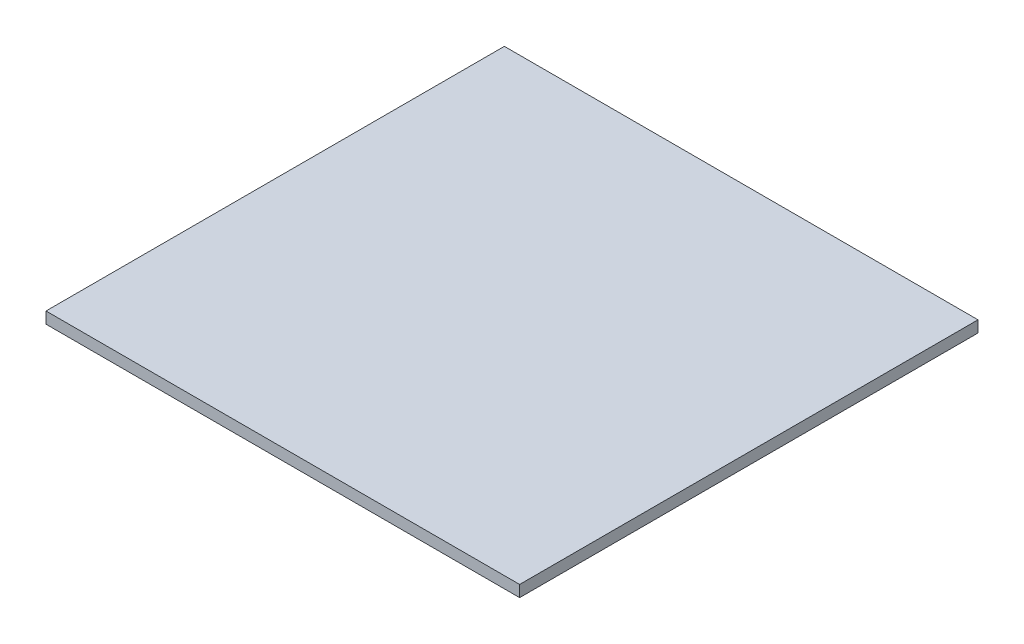
ISO-10303-21;
HEADER;
FILE_DESCRIPTION(('STEP AP214'),'2;1');
FILE_NAME('part.step','',(''),(''),'','','');
FILE_SCHEMA(('AUTOMOTIVE_DESIGN { 1 0 10303 214 1 1 1 1 }'));
ENDSEC;
DATA;
#1=APPLICATION_CONTEXT('core data for automotive mechanical design processes');
#2=APPLICATION_PROTOCOL_DEFINITION('international standard','automotive_design',2000,#1);
#3=PRODUCT_CONTEXT('',#1,'mechanical');
#4=PRODUCT('Part','Part','',(#3));
#5=PRODUCT_RELATED_PRODUCT_CATEGORY('part','',(#4));
#6=PRODUCT_DEFINITION_FORMATION('','',#4);
#7=PRODUCT_DEFINITION_CONTEXT('part definition',#1,'design');
#8=PRODUCT_DEFINITION('design','',#6,#7);
#9=PRODUCT_DEFINITION_SHAPE('','',#8);
#10=(LENGTH_UNIT() NAMED_UNIT(*) SI_UNIT(.MILLI.,.METRE.));
#11=(NAMED_UNIT(*) PLANE_ANGLE_UNIT() SI_UNIT($,.RADIAN.));
#12=(NAMED_UNIT(*) SI_UNIT($,.STERADIAN.) SOLID_ANGLE_UNIT());
#13=UNCERTAINTY_MEASURE_WITH_UNIT(LENGTH_MEASURE(1.E-05),#10,'distance_accuracy_value','');
#14=(GEOMETRIC_REPRESENTATION_CONTEXT(3) GLOBAL_UNCERTAINTY_ASSIGNED_CONTEXT((#13)) GLOBAL_UNIT_ASSIGNED_CONTEXT((#10,
#11,#12)) REPRESENTATION_CONTEXT('',''));
#15=CARTESIAN_POINT('',(0.,0.,0.));
#16=DIRECTION('',(0.,0.,1.));
#17=DIRECTION('',(1.,0.,0.));
#18=AXIS2_PLACEMENT_3D('',#15,#16,#17);
#19=CARTESIAN_POINT('',(-300.,15.,-300.));
#20=DIRECTION('',(0.,0.,1.));
#21=DIRECTION('',(1.,0.,0.));
#22=AXIS2_PLACEMENT_3D('',#19,#20,#21);
#23=PLANE('',#22);
#24=DIRECTION('',(-1.,0.,0.));
#25=VECTOR('',#24,1.);
#26=CARTESIAN_POINT('',(-300.,0.,-300.));
#27=LINE('',#26,#25);
#28=CARTESIAN_POINT('',(320.,0.,-300.));
#29=VERTEX_POINT('',#28);
#30=CARTESIAN_POINT('',(-300.,0.,-300.));
#31=VERTEX_POINT('',#30);
#32=EDGE_CURVE('E63',#29,#31,#27,.T.);
#33=ORIENTED_EDGE('',*,*,#32,.T.);
#34=DIRECTION('',(0.,-1.,0.));
#35=VECTOR('',#34,1.);
#36=CARTESIAN_POINT('',(-300.,15.,-300.));
#37=LINE('',#36,#35);
#38=CARTESIAN_POINT('',(-300.,15.,-300.));
#39=VERTEX_POINT('',#38);
#40=EDGE_CURVE('E11',#39,#31,#37,.T.);
#41=ORIENTED_EDGE('',*,*,#40,.F.);
#42=DIRECTION('',(-1.,0.,0.));
#43=VECTOR('',#42,1.);
#44=CARTESIAN_POINT('',(-300.,15.,-300.));
#45=LINE('',#44,#43);
#46=CARTESIAN_POINT('',(320.,15.,-300.));
#47=VERTEX_POINT('',#46);
#48=EDGE_CURVE('E88',#47,#39,#45,.T.);
#49=ORIENTED_EDGE('',*,*,#48,.F.);
#50=DIRECTION('',(0.,1.,0.));
#51=VECTOR('',#50,1.);
#52=CARTESIAN_POINT('',(320.,0.,-300.));
#53=LINE('',#52,#51);
#54=EDGE_CURVE('E96',#29,#47,#53,.T.);
#55=ORIENTED_EDGE('',*,*,#54,.F.);
#56=EDGE_LOOP('',(#33,#41,#49,#55));
#57=FACE_BOUND('',#56,.T.);
#58=ADVANCED_FACE('F36',(#57),#23,.F.);
#59=CARTESIAN_POINT('',(-300.,15.,300.));
#60=DIRECTION('',(1.,0.,0.));
#61=DIRECTION('',(0.,0.,-1.));
#62=AXIS2_PLACEMENT_3D('',#59,#60,#61);
#63=PLANE('',#62);
#64=DIRECTION('',(0.,0.,1.));
#65=VECTOR('',#64,1.);
#66=CARTESIAN_POINT('',(-300.,0.,300.));
#67=LINE('',#66,#65);
#68=CARTESIAN_POINT('',(-300.,0.,300.));
#69=VERTEX_POINT('',#68);
#70=EDGE_CURVE('E89',#31,#69,#67,.T.);
#71=ORIENTED_EDGE('',*,*,#70,.T.);
#72=DIRECTION('',(0.,-1.,0.));
#73=VECTOR('',#72,1.);
#74=CARTESIAN_POINT('',(-300.,15.,300.));
#75=LINE('',#74,#73);
#76=CARTESIAN_POINT('',(-300.,15.,300.));
#77=VERTEX_POINT('',#76);
#78=EDGE_CURVE('E44',#77,#69,#75,.T.);
#79=ORIENTED_EDGE('',*,*,#78,.F.);
#80=DIRECTION('',(0.,0.,1.));
#81=VECTOR('',#80,1.);
#82=CARTESIAN_POINT('',(-300.,15.,300.));
#83=LINE('',#82,#81);
#84=EDGE_CURVE('E52',#39,#77,#83,.T.);
#85=ORIENTED_EDGE('',*,*,#84,.F.);
#86=ORIENTED_EDGE('',*,*,#40,.T.);
#87=EDGE_LOOP('',(#71,#79,#85,#86));
#88=FACE_BOUND('',#87,.T.);
#89=ADVANCED_FACE('F109',(#88),#63,.F.);
#90=CARTESIAN_POINT('',(-300.,15.,300.));
#91=DIRECTION('',(0.,0.,-1.));
#92=DIRECTION('',(-1.,0.,0.));
#93=AXIS2_PLACEMENT_3D('',#90,#91,#92);
#94=PLANE('',#93);
#95=DIRECTION('',(1.,0.,0.));
#96=VECTOR('',#95,1.);
#97=CARTESIAN_POINT('',(-300.,0.,300.));
#98=LINE('',#97,#96);
#99=CARTESIAN_POINT('',(320.,0.,300.));
#100=VERTEX_POINT('',#99);
#101=EDGE_CURVE('E81',#69,#100,#98,.T.);
#102=ORIENTED_EDGE('',*,*,#101,.T.);
#103=DIRECTION('',(0.,-1.,0.));
#104=VECTOR('',#103,1.);
#105=CARTESIAN_POINT('',(320.,0.,300.));
#106=LINE('',#105,#104);
#107=CARTESIAN_POINT('',(320.,15.,300.));
#108=VERTEX_POINT('',#107);
#109=EDGE_CURVE('E85',#108,#100,#106,.T.);
#110=ORIENTED_EDGE('',*,*,#109,.F.);
#111=DIRECTION('',(1.,0.,0.));
#112=VECTOR('',#111,1.);
#113=CARTESIAN_POINT('',(-300.,15.,300.));
#114=LINE('',#113,#112);
#115=EDGE_CURVE('E68',#77,#108,#114,.T.);
#116=ORIENTED_EDGE('',*,*,#115,.F.);
#117=ORIENTED_EDGE('',*,*,#78,.T.);
#118=EDGE_LOOP('',(#102,#110,#116,#117));
#119=FACE_BOUND('',#118,.T.);
#120=ADVANCED_FACE('F83',(#119),#94,.F.);
#121=CARTESIAN_POINT('',(0.,15.,0.));
#122=DIRECTION('',(0.,-1.,0.));
#123=DIRECTION('',(0.,0.,-1.));
#124=AXIS2_PLACEMENT_3D('',#121,#122,#123);
#125=PLANE('',#124);
#126=ORIENTED_EDGE('',*,*,#115,.T.);
#127=DIRECTION('',(0.,0.,1.));
#128=VECTOR('',#127,1.);
#129=CARTESIAN_POINT('',(320.,15.,300.));
#130=LINE('',#129,#128);
#131=EDGE_CURVE('E99',#47,#108,#130,.T.);
#132=ORIENTED_EDGE('',*,*,#131,.F.);
#133=ORIENTED_EDGE('',*,*,#48,.T.);
#134=ORIENTED_EDGE('',*,*,#84,.T.);
#135=EDGE_LOOP('',(#126,#132,#133,#134));
#136=FACE_BOUND('',#135,.T.);
#137=ADVANCED_FACE('F110',(#136),#125,.F.);
#138=CARTESIAN_POINT('',(0.,0.,0.));
#139=DIRECTION('',(0.,-1.,0.));
#140=DIRECTION('',(0.,0.,-1.));
#141=AXIS2_PLACEMENT_3D('',#138,#139,#140);
#142=PLANE('',#141);
#143=ORIENTED_EDGE('',*,*,#32,.F.);
#144=DIRECTION('',(0.,0.,-1.));
#145=VECTOR('',#144,1.);
#146=CARTESIAN_POINT('',(320.,0.,300.));
#147=LINE('',#146,#145);
#148=EDGE_CURVE('E92',#100,#29,#147,.T.);
#149=ORIENTED_EDGE('',*,*,#148,.F.);
#150=ORIENTED_EDGE('',*,*,#101,.F.);
#151=ORIENTED_EDGE('',*,*,#70,.F.);
#152=EDGE_LOOP('',(#143,#149,#150,#151));
#153=FACE_BOUND('',#152,.T.);
#154=ADVANCED_FACE('F93',(#153),#142,.T.);
#155=CARTESIAN_POINT('',(320.,0.,0.));
#156=DIRECTION('',(-1.,0.,0.));
#157=DIRECTION('',(0.,0.,1.));
#158=AXIS2_PLACEMENT_3D('',#155,#156,#157);
#159=PLANE('',#158);
#160=ORIENTED_EDGE('',*,*,#109,.T.);
#161=ORIENTED_EDGE('',*,*,#148,.T.);
#162=ORIENTED_EDGE('',*,*,#54,.T.);
#163=ORIENTED_EDGE('',*,*,#131,.T.);
#164=EDGE_LOOP('',(#160,#161,#162,#163));
#165=FACE_BOUND('',#164,.T.);
#166=ADVANCED_FACE('F98',(#165),#159,.F.);
#167=CLOSED_SHELL('',(#58,#89,#120,#137,#154,#166));
#168=MANIFOLD_SOLID_BREP('B2',#167);
#169=ADVANCED_BREP_SHAPE_REPRESENTATION('',(#18,#168),#14);
#170=SHAPE_DEFINITION_REPRESENTATION(#9,#169);
ENDSEC;
END-ISO-10303-21;
